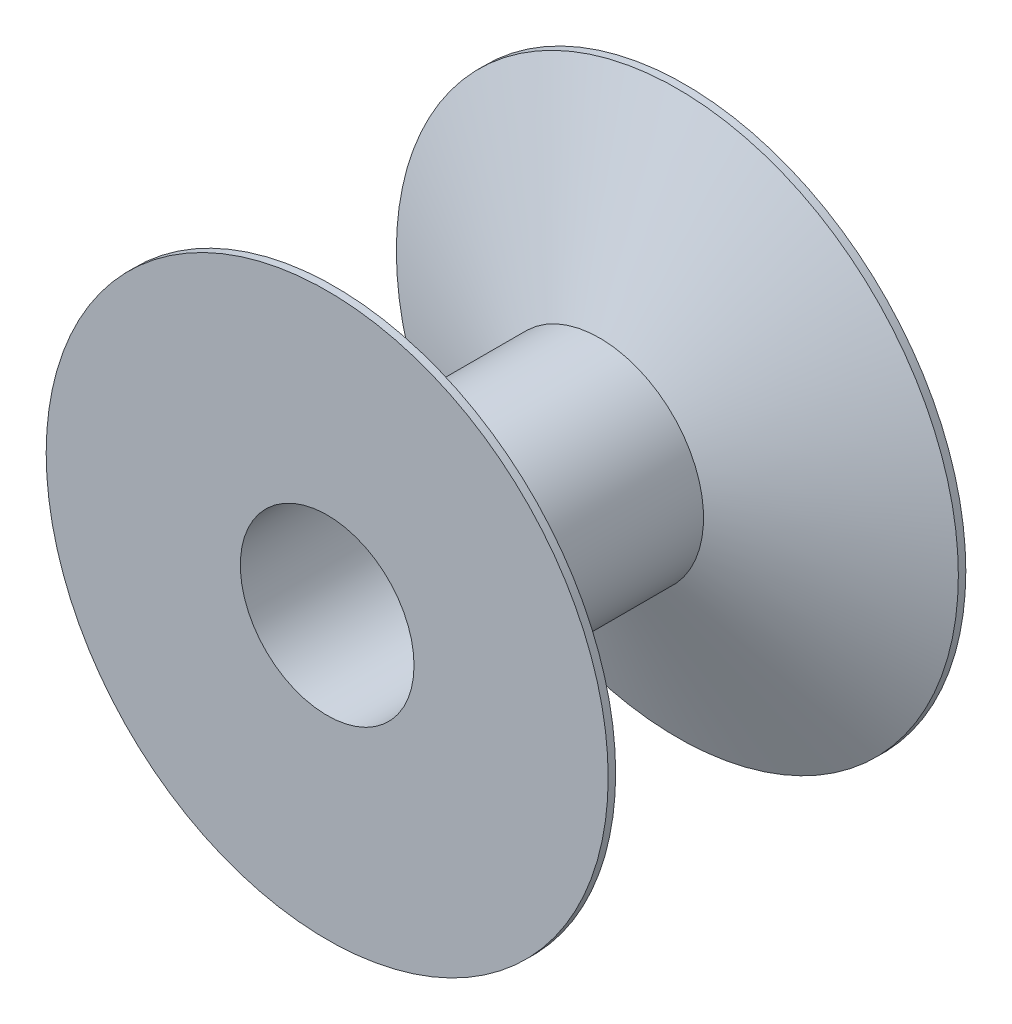
ISO-10303-21;
HEADER;
FILE_DESCRIPTION(('STEP AP214'),'2;1');
FILE_NAME('part.step','',(''),(''),'','','');
FILE_SCHEMA(('AUTOMOTIVE_DESIGN { 1 0 10303 214 1 1 1 1 }'));
ENDSEC;
DATA;
#1=APPLICATION_CONTEXT('core data for automotive mechanical design processes');
#2=APPLICATION_PROTOCOL_DEFINITION('international standard','automotive_design',2000,#1);
#3=PRODUCT_CONTEXT('',#1,'mechanical');
#4=PRODUCT('Part','Part','',(#3));
#5=PRODUCT_RELATED_PRODUCT_CATEGORY('part','',(#4));
#6=PRODUCT_DEFINITION_FORMATION('','',#4);
#7=PRODUCT_DEFINITION_CONTEXT('part definition',#1,'design');
#8=PRODUCT_DEFINITION('design','',#6,#7);
#9=PRODUCT_DEFINITION_SHAPE('','',#8);
#10=(LENGTH_UNIT() NAMED_UNIT(*) SI_UNIT(.MILLI.,.METRE.));
#11=(NAMED_UNIT(*) PLANE_ANGLE_UNIT() SI_UNIT($,.RADIAN.));
#12=(NAMED_UNIT(*) SI_UNIT($,.STERADIAN.) SOLID_ANGLE_UNIT());
#13=UNCERTAINTY_MEASURE_WITH_UNIT(LENGTH_MEASURE(1.E-05),#10,'distance_accuracy_value','');
#14=(GEOMETRIC_REPRESENTATION_CONTEXT(3) GLOBAL_UNCERTAINTY_ASSIGNED_CONTEXT((#13)) GLOBAL_UNIT_ASSIGNED_CONTEXT((#10,
#11,#12)) REPRESENTATION_CONTEXT('',''));
#15=CARTESIAN_POINT('',(0.,0.,0.));
#16=DIRECTION('',(0.,0.,1.));
#17=DIRECTION('',(1.,0.,0.));
#18=AXIS2_PLACEMENT_3D('',#15,#16,#17);
#19=CARTESIAN_POINT('',(0.,0.,16.));
#20=DIRECTION('',(0.,0.,1.));
#21=DIRECTION('',(1.,0.,0.));
#22=AXIS2_PLACEMENT_3D('',#19,#20,#21);
#23=PLANE('',#22);
#24=CARTESIAN_POINT('',(0.,0.,16.));
#25=DIRECTION('',(0.,0.,1.));
#26=DIRECTION('',(1.,0.,0.));
#27=AXIS2_PLACEMENT_3D('',#24,#25,#26);
#28=CIRCLE('',#27,5.1);
#29=CARTESIAN_POINT('',(5.1,0.,16.));
#30=VERTEX_POINT('',#29);
#31=EDGE_CURVE('E11',#30,#30,#28,.T.);
#32=ORIENTED_EDGE('',*,*,#31,.F.);
#33=EDGE_LOOP('',(#32));
#34=FACE_BOUND('',#33,.T.);
#35=CARTESIAN_POINT('',(0.,0.,16.));
#36=DIRECTION('',(0.,0.,1.));
#37=DIRECTION('',(1.,0.,0.));
#38=AXIS2_PLACEMENT_3D('',#35,#36,#37);
#39=CIRCLE('',#38,16.5);
#40=CARTESIAN_POINT('',(16.5,0.,16.));
#41=VERTEX_POINT('',#40);
#42=EDGE_CURVE('E65',#41,#41,#39,.T.);
#43=ORIENTED_EDGE('',*,*,#42,.T.);
#44=EDGE_LOOP('',(#43));
#45=FACE_BOUND('',#44,.T.);
#46=ADVANCED_FACE('F42',(#34,#45),#23,.T.);
#47=CARTESIAN_POINT('',(0.,0.,-5.));
#48=DIRECTION('',(0.,0.,-1.));
#49=DIRECTION('',(1.,0.,0.));
#50=AXIS2_PLACEMENT_3D('',#47,#48,#49);
#51=PLANE('',#50);
#52=CARTESIAN_POINT('',(0.,0.,-5.));
#53=DIRECTION('',(0.,0.,1.));
#54=DIRECTION('',(1.,0.,0.));
#55=AXIS2_PLACEMENT_3D('',#52,#53,#54);
#56=CIRCLE('',#55,5.1);
#57=CARTESIAN_POINT('',(5.1,0.,-5.));
#58=VERTEX_POINT('',#57);
#59=EDGE_CURVE('E50',#58,#58,#56,.T.);
#60=ORIENTED_EDGE('',*,*,#59,.T.);
#61=EDGE_LOOP('',(#60));
#62=FACE_BOUND('',#61,.T.);
#63=CARTESIAN_POINT('',(0.,0.,-5.));
#64=DIRECTION('',(0.,0.,1.));
#65=DIRECTION('',(1.,0.,0.));
#66=AXIS2_PLACEMENT_3D('',#63,#64,#65);
#67=CIRCLE('',#66,16.5);
#68=CARTESIAN_POINT('',(16.5,0.,-5.));
#69=VERTEX_POINT('',#68);
#70=EDGE_CURVE('E68',#69,#69,#67,.T.);
#71=ORIENTED_EDGE('',*,*,#70,.F.);
#72=EDGE_LOOP('',(#71));
#73=FACE_BOUND('',#72,.T.);
#74=ADVANCED_FACE('F91',(#62,#73),#51,.T.);
#75=CARTESIAN_POINT('',(0.,0.,11.));
#76=DIRECTION('',(0.,0.,-1.));
#77=DIRECTION('',(-1.,0.,0.));
#78=AXIS2_PLACEMENT_3D('',#75,#76,#77);
#79=CYLINDRICAL_SURFACE('',#78,5.1);
#80=ORIENTED_EDGE('',*,*,#31,.T.);
#81=EDGE_LOOP('',(#80));
#82=FACE_BOUND('',#81,.T.);
#83=ORIENTED_EDGE('',*,*,#59,.F.);
#84=EDGE_LOOP('',(#83));
#85=FACE_BOUND('',#84,.T.);
#86=ADVANCED_FACE('F97',(#82,#85),#79,.F.);
#87=CARTESIAN_POINT('',(0.,0.,-5.));
#88=DIRECTION('',(0.,0.,1.));
#89=DIRECTION('',(1.,0.,0.));
#90=AXIS2_PLACEMENT_3D('',#87,#88,#89);
#91=CYLINDRICAL_SURFACE('',#90,16.5);
#92=CARTESIAN_POINT('',(0.,0.,15.5614035087719));
#93=DIRECTION('',(0.,0.,1.));
#94=DIRECTION('',(1.,0.,0.));
#95=AXIS2_PLACEMENT_3D('',#92,#93,#94);
#96=CIRCLE('',#95,16.5);
#97=CARTESIAN_POINT('',(16.5,0.,15.5614035087719));
#98=VERTEX_POINT('',#97);
#99=EDGE_CURVE('E46',#98,#98,#96,.T.);
#100=CARTESIAN_POINT('',(16.5,0.,16.));
#101=CARTESIAN_POINT('',(16.5,0.,15.9954312865497));
#102=CARTESIAN_POINT('',(16.5,0.,15.9908625730994));
#103=CARTESIAN_POINT('',(16.5,0.,15.9817251461988));
#104=CARTESIAN_POINT('',(16.5,0.,15.9771564327485));
#105=CARTESIAN_POINT('',(16.5,0.,15.968019005848));
#106=CARTESIAN_POINT('',(16.5,0.,15.9634502923977));
#107=CARTESIAN_POINT('',(16.5,0.,15.9543128654971));
#108=CARTESIAN_POINT('',(16.5,0.,15.9497441520468));
#109=CARTESIAN_POINT('',(16.5,0.,15.9406067251462));
#110=CARTESIAN_POINT('',(16.5,0.,15.9360380116959));
#111=CARTESIAN_POINT('',(16.5,0.,15.9269005847953));
#112=CARTESIAN_POINT('',(16.5,0.,15.922331871345));
#113=CARTESIAN_POINT('',(16.5,0.,15.9131944444444));
#114=CARTESIAN_POINT('',(16.5,0.,15.9086257309941));
#115=CARTESIAN_POINT('',(16.5,0.,15.8994883040936));
#116=CARTESIAN_POINT('',(16.5,0.,15.8949195906433));
#117=CARTESIAN_POINT('',(16.5,0.,15.8857821637427));
#118=CARTESIAN_POINT('',(16.5,0.,15.8812134502924));
#119=CARTESIAN_POINT('',(16.5,0.,15.8720760233918));
#120=CARTESIAN_POINT('',(16.5,0.,15.8675073099415));
#121=CARTESIAN_POINT('',(16.5,0.,15.8583698830409));
#122=CARTESIAN_POINT('',(16.5,0.,15.8538011695906));
#123=CARTESIAN_POINT('',(16.5,0.,15.8446637426901));
#124=CARTESIAN_POINT('',(16.5,0.,15.8400950292398));
#125=CARTESIAN_POINT('',(16.5,0.,15.8309576023392));
#126=CARTESIAN_POINT('',(16.5,0.,15.8263888888889));
#127=CARTESIAN_POINT('',(16.5,0.,15.8172514619883));
#128=CARTESIAN_POINT('',(16.5,0.,15.812682748538));
#129=CARTESIAN_POINT('',(16.5,0.,15.8035453216374));
#130=CARTESIAN_POINT('',(16.5,0.,15.7989766081871));
#131=CARTESIAN_POINT('',(16.5,0.,15.7898391812865));
#132=CARTESIAN_POINT('',(16.5,0.,15.7852704678363));
#133=CARTESIAN_POINT('',(16.5,0.,15.7761330409357));
#134=CARTESIAN_POINT('',(16.5,0.,15.7715643274854));
#135=CARTESIAN_POINT('',(16.5,0.,15.7624269005848));
#136=CARTESIAN_POINT('',(16.5,0.,15.7578581871345));
#137=CARTESIAN_POINT('',(16.5,0.,15.7487207602339));
#138=CARTESIAN_POINT('',(16.5,0.,15.7441520467836));
#139=CARTESIAN_POINT('',(16.5,0.,15.735014619883));
#140=CARTESIAN_POINT('',(16.5,0.,15.7304459064327));
#141=CARTESIAN_POINT('',(16.5,0.,15.7213084795322));
#142=CARTESIAN_POINT('',(16.5,0.,15.7167397660819));
#143=CARTESIAN_POINT('',(16.5,0.,15.7076023391813));
#144=CARTESIAN_POINT('',(16.5,0.,15.703033625731));
#145=CARTESIAN_POINT('',(16.5,0.,15.6938961988304));
#146=CARTESIAN_POINT('',(16.5,0.,15.6893274853801));
#147=CARTESIAN_POINT('',(16.5,0.,15.6801900584795));
#148=CARTESIAN_POINT('',(16.5,0.,15.6756213450292));
#149=CARTESIAN_POINT('',(16.5,0.,15.6664839181286));
#150=CARTESIAN_POINT('',(16.5,0.,15.6619152046784));
#151=CARTESIAN_POINT('',(16.5,0.,15.6527777777778));
#152=CARTESIAN_POINT('',(16.5,0.,15.6482090643275));
#153=CARTESIAN_POINT('',(16.5,0.,15.6390716374269));
#154=CARTESIAN_POINT('',(16.5,0.,15.6345029239766));
#155=CARTESIAN_POINT('',(16.5,0.,15.625365497076));
#156=CARTESIAN_POINT('',(16.5,0.,15.6207967836257));
#157=CARTESIAN_POINT('',(16.5,0.,15.6116593567251));
#158=CARTESIAN_POINT('',(16.5,0.,15.6070906432748));
#159=CARTESIAN_POINT('',(16.5,0.,15.5979532163743));
#160=CARTESIAN_POINT('',(16.5,0.,15.593384502924));
#161=CARTESIAN_POINT('',(16.5,0.,15.5842470760234));
#162=CARTESIAN_POINT('',(16.5,0.,15.5796783625731));
#163=CARTESIAN_POINT('',(16.5,0.,15.5705409356725));
#164=CARTESIAN_POINT('',(16.5,0.,15.5659722222222));
#165=CARTESIAN_POINT('',(16.5,0.,15.5614035087719));
#166=B_SPLINE_CURVE_WITH_KNOTS('',3,(#100,#101,#102,#103,#104,#105,#106,#107,#108,#109,#110,
#111,#112,#113,#114,#115,#116,#117,#118,#119,#120,#121,#122,#123,#124,#125,#126,#127,#128,#129,
#130,#131,#132,#133,#134,#135,#136,#137,#138,#139,#140,#141,#142,#143,#144,#145,#146,#147,#148,
#149,#150,#151,#152,#153,#154,#155,#156,#157,#158,#159,#160,#161,#162,#163,#164,#165),
.UNSPECIFIED.,.F.,.F.,(4,2,2,2,2,2,2,2,2,2,2,2,2,2,2,2,2,2,2,2,2,2,2,2,2,2,2,2,2,2,2,2,4),(0.,
0.013706140350879,0.0274122807017545,0.0411184210526334,0.0548245614035089,0.0685307017543879,
0.0822368421052634,0.0959429824561424,0.109649122807018,0.123355263157897,0.137061403508776,
0.150767543859651,0.16447368421053,0.178179824561406,0.191885964912285,0.20559210526316,
0.219298245614039,0.233004385964918,0.246710526315794,0.260416666666673,0.274122807017548,
0.287828947368427,0.301535087719303,0.315241228070182,0.328947368421061,0.342653508771936,
0.356359649122815,0.370065789473691,0.38377192982457,0.397478070175445,0.411184210526324,
0.4248903508772,0.438596491228078),.UNSPECIFIED.);
#167=EDGE_CURVE('BSEAM75',#41,#98,#166,.T.);
#168=ORIENTED_EDGE('',*,*,#42,.F.);
#169=ORIENTED_EDGE('',*,*,#99,.T.);
#170=ORIENTED_EDGE('',*,*,#167,.T.);
#171=ORIENTED_EDGE('',*,*,#167,.F.);
#172=EDGE_LOOP('',(#168,#170,#169,#171));
#173=FACE_BOUND('',#172,.T.);
#174=ADVANCED_FACE('F75',(#173),#91,.T.);
#175=CARTESIAN_POINT('',(0.,0.,-4.56140350877193));
#176=DIRECTION('',(0.,0.,-1.));
#177=DIRECTION('',(-1.,0.,0.));
#178=AXIS2_PLACEMENT_3D('',#175,#176,#177);
#179=CIRCLE('',#178,16.5);
#180=CARTESIAN_POINT('',(16.5,0.,-4.56140350877193));
#181=VERTEX_POINT('',#180);
#182=EDGE_CURVE('E60',#181,#181,#179,.T.);
#183=CARTESIAN_POINT('',(16.5,0.,-5.));
#184=CARTESIAN_POINT('',(16.5,0.,-4.99543128654971));
#185=CARTESIAN_POINT('',(16.5,0.,-4.99086257309942));
#186=CARTESIAN_POINT('',(16.5,0.,-4.98172514619883));
#187=CARTESIAN_POINT('',(16.5,0.,-4.97715643274854));
#188=CARTESIAN_POINT('',(16.5,0.,-4.96801900584795));
#189=CARTESIAN_POINT('',(16.5,0.,-4.96345029239766));
#190=CARTESIAN_POINT('',(16.5,0.,-4.95431286549708));
#191=CARTESIAN_POINT('',(16.5,0.,-4.94974415204678));
#192=CARTESIAN_POINT('',(16.5,0.,-4.9406067251462));
#193=CARTESIAN_POINT('',(16.5,0.,-4.93603801169591));
#194=CARTESIAN_POINT('',(16.5,0.,-4.92690058479532));
#195=CARTESIAN_POINT('',(16.5,0.,-4.92233187134503));
#196=CARTESIAN_POINT('',(16.5,0.,-4.91319444444444));
#197=CARTESIAN_POINT('',(16.5,0.,-4.90862573099415));
#198=CARTESIAN_POINT('',(16.5,0.,-4.89948830409357));
#199=CARTESIAN_POINT('',(16.5,0.,-4.89491959064328));
#200=CARTESIAN_POINT('',(16.5,0.,-4.88578216374269));
#201=CARTESIAN_POINT('',(16.5,0.,-4.8812134502924));
#202=CARTESIAN_POINT('',(16.5,0.,-4.87207602339181));
#203=CARTESIAN_POINT('',(16.5,0.,-4.86750730994152));
#204=CARTESIAN_POINT('',(16.5,0.,-4.85836988304094));
#205=CARTESIAN_POINT('',(16.5,0.,-4.85380116959064));
#206=CARTESIAN_POINT('',(16.5,0.,-4.84466374269006));
#207=CARTESIAN_POINT('',(16.5,0.,-4.84009502923977));
#208=CARTESIAN_POINT('',(16.5,0.,-4.83095760233918));
#209=CARTESIAN_POINT('',(16.5,0.,-4.82638888888889));
#210=CARTESIAN_POINT('',(16.5,0.,-4.8172514619883));
#211=CARTESIAN_POINT('',(16.5,0.,-4.81268274853801));
#212=CARTESIAN_POINT('',(16.5,0.,-4.80354532163743));
#213=CARTESIAN_POINT('',(16.5,0.,-4.79897660818713));
#214=CARTESIAN_POINT('',(16.5,0.,-4.78983918128655));
#215=CARTESIAN_POINT('',(16.5,0.,-4.78527046783626));
#216=CARTESIAN_POINT('',(16.5,0.,-4.77613304093567));
#217=CARTESIAN_POINT('',(16.5,0.,-4.77156432748538));
#218=CARTESIAN_POINT('',(16.5,0.,-4.76242690058479));
#219=CARTESIAN_POINT('',(16.5,0.,-4.7578581871345));
#220=CARTESIAN_POINT('',(16.5,0.,-4.74872076023392));
#221=CARTESIAN_POINT('',(16.5,0.,-4.74415204678363));
#222=CARTESIAN_POINT('',(16.5,0.,-4.73501461988304));
#223=CARTESIAN_POINT('',(16.5,0.,-4.73044590643275));
#224=CARTESIAN_POINT('',(16.5,0.,-4.72130847953216));
#225=CARTESIAN_POINT('',(16.5,0.,-4.71673976608187));
#226=CARTESIAN_POINT('',(16.5,0.,-4.70760233918128));
#227=CARTESIAN_POINT('',(16.5,0.,-4.70303362573099));
#228=CARTESIAN_POINT('',(16.5,0.,-4.69389619883041));
#229=CARTESIAN_POINT('',(16.5,0.,-4.68932748538012));
#230=CARTESIAN_POINT('',(16.5,0.,-4.68019005847953));
#231=CARTESIAN_POINT('',(16.5,0.,-4.67562134502924));
#232=CARTESIAN_POINT('',(16.5,0.,-4.66648391812865));
#233=CARTESIAN_POINT('',(16.5,0.,-4.66191520467836));
#234=CARTESIAN_POINT('',(16.5,0.,-4.65277777777778));
#235=CARTESIAN_POINT('',(16.5,0.,-4.64820906432748));
#236=CARTESIAN_POINT('',(16.5,0.,-4.6390716374269));
#237=CARTESIAN_POINT('',(16.5,0.,-4.63450292397661));
#238=CARTESIAN_POINT('',(16.5,0.,-4.62536549707602));
#239=CARTESIAN_POINT('',(16.5,0.,-4.62079678362573));
#240=CARTESIAN_POINT('',(16.5,0.,-4.61165935672514));
#241=CARTESIAN_POINT('',(16.5,0.,-4.60709064327485));
#242=CARTESIAN_POINT('',(16.5,0.,-4.59795321637427));
#243=CARTESIAN_POINT('',(16.5,0.,-4.59338450292397));
#244=CARTESIAN_POINT('',(16.5,0.,-4.58424707602339));
#245=CARTESIAN_POINT('',(16.5,0.,-4.5796783625731));
#246=CARTESIAN_POINT('',(16.5,0.,-4.57054093567251));
#247=CARTESIAN_POINT('',(16.5,0.,-4.56597222222222));
#248=CARTESIAN_POINT('',(16.5,0.,-4.56140350877193));
#249=B_SPLINE_CURVE_WITH_KNOTS('',3,(#183,#184,#185,#186,#187,#188,#189,#190,#191,#192,#193,
#194,#195,#196,#197,#198,#199,#200,#201,#202,#203,#204,#205,#206,#207,#208,#209,#210,#211,#212,
#213,#214,#215,#216,#217,#218,#219,#220,#221,#222,#223,#224,#225,#226,#227,#228,#229,#230,#231,
#232,#233,#234,#235,#236,#237,#238,#239,#240,#241,#242,#243,#244,#245,#246,#247,#248),
.UNSPECIFIED.,.F.,.F.,(4,2,2,2,2,2,2,2,2,2,2,2,2,2,2,2,2,2,2,2,2,2,2,2,2,2,2,2,2,2,2,2,4),(0.,
0.0137061403508781,0.0274122807017553,0.0411184210526326,0.0548245614035098,0.0685307017543871,
0.0822368421052643,0.0959429824561415,0.109649122807019,0.123355263157896,0.137061403508773,
0.150767543859651,0.164473684210529,0.178179824561406,0.191885964912283,0.20559210526316,
0.219298245614037,0.233004385964915,0.246710526315792,0.260416666666669,0.274122807017546,
0.287828947368425,0.301535087719302,0.315241228070179,0.328947368421056,0.342653508771934,
0.356359649122811,0.370065789473688,0.383771929824565,0.397478070175442,0.41118421052632,
0.424890350877197,0.438596491228075),.UNSPECIFIED.);
#250=EDGE_CURVE('BSEAM104',#69,#181,#249,.T.);
#251=ORIENTED_EDGE('',*,*,#70,.T.);
#252=ORIENTED_EDGE('',*,*,#182,.T.);
#253=ORIENTED_EDGE('',*,*,#250,.T.);
#254=ORIENTED_EDGE('',*,*,#250,.F.);
#255=EDGE_LOOP('',(#251,#253,#252,#254));
#256=FACE_BOUND('',#255,.T.);
#257=ADVANCED_FACE('F104',(#256),#91,.T.);
#258=CARTESIAN_POINT('',(0.,0.,0.));
#259=DIRECTION('',(0.,0.,-1.));
#260=DIRECTION('',(-1.,0.,0.));
#261=AXIS2_PLACEMENT_3D('',#258,#259,#260);
#262=CONICAL_SURFACE('',#261,6.1,1.15746592225557);
#263=CARTESIAN_POINT('',(0.,0.,0.));
#264=DIRECTION('',(0.,0.,-1.));
#265=DIRECTION('',(-1.,0.,0.));
#266=AXIS2_PLACEMENT_3D('',#263,#264,#265);
#267=CIRCLE('',#266,6.1);
#268=CARTESIAN_POINT('',(-6.1,0.,0.));
#269=VERTEX_POINT('',#268);
#270=EDGE_CURVE('E54',#269,#269,#267,.T.);
#271=ORIENTED_EDGE('',*,*,#270,.T.);
#272=EDGE_LOOP('',(#271));
#273=FACE_BOUND('',#272,.T.);
#274=ORIENTED_EDGE('',*,*,#182,.F.);
#275=EDGE_LOOP('',(#274));
#276=FACE_BOUND('',#275,.T.);
#277=ADVANCED_FACE('F85',(#273,#276),#262,.T.);
#278=CARTESIAN_POINT('',(0.,0.,11.));
#279=DIRECTION('',(0.,0.,-1.));
#280=DIRECTION('',(-1.,0.,0.));
#281=AXIS2_PLACEMENT_3D('',#278,#279,#280);
#282=CYLINDRICAL_SURFACE('',#281,6.1);
#283=CARTESIAN_POINT('',(0.,0.,11.));
#284=DIRECTION('',(0.,0.,-1.));
#285=DIRECTION('',(-1.,0.,0.));
#286=AXIS2_PLACEMENT_3D('',#283,#284,#285);
#287=CIRCLE('',#286,6.1);
#288=CARTESIAN_POINT('',(-6.1,0.,11.));
#289=VERTEX_POINT('',#288);
#290=EDGE_CURVE('E57',#289,#289,#287,.T.);
#291=ORIENTED_EDGE('',*,*,#290,.T.);
#292=EDGE_LOOP('',(#291));
#293=FACE_BOUND('',#292,.T.);
#294=ORIENTED_EDGE('',*,*,#270,.F.);
#295=EDGE_LOOP('',(#294));
#296=FACE_BOUND('',#295,.T.);
#297=ADVANCED_FACE('F44',(#293,#296),#282,.T.);
#298=CARTESIAN_POINT('',(0.,0.,16.));
#299=DIRECTION('',(0.,0.,1.));
#300=DIRECTION('',(1.,0.,0.));
#301=AXIS2_PLACEMENT_3D('',#298,#299,#300);
#302=CONICAL_SURFACE('',#301,17.5,1.15746592225557);
#303=ORIENTED_EDGE('',*,*,#290,.F.);
#304=EDGE_LOOP('',(#303));
#305=FACE_BOUND('',#304,.T.);
#306=ORIENTED_EDGE('',*,*,#99,.F.);
#307=EDGE_LOOP('',(#306));
#308=FACE_BOUND('',#307,.T.);
#309=ADVANCED_FACE('F77',(#305,#308),#302,.T.);
#310=CLOSED_SHELL('',(#46,#74,#86,#174,#257,#277,#297,#309));
#311=MANIFOLD_SOLID_BREP('B2',#310);
#312=ADVANCED_BREP_SHAPE_REPRESENTATION('',(#18,#311),#14);
#313=SHAPE_DEFINITION_REPRESENTATION(#9,#312);
ENDSEC;
END-ISO-10303-21;
